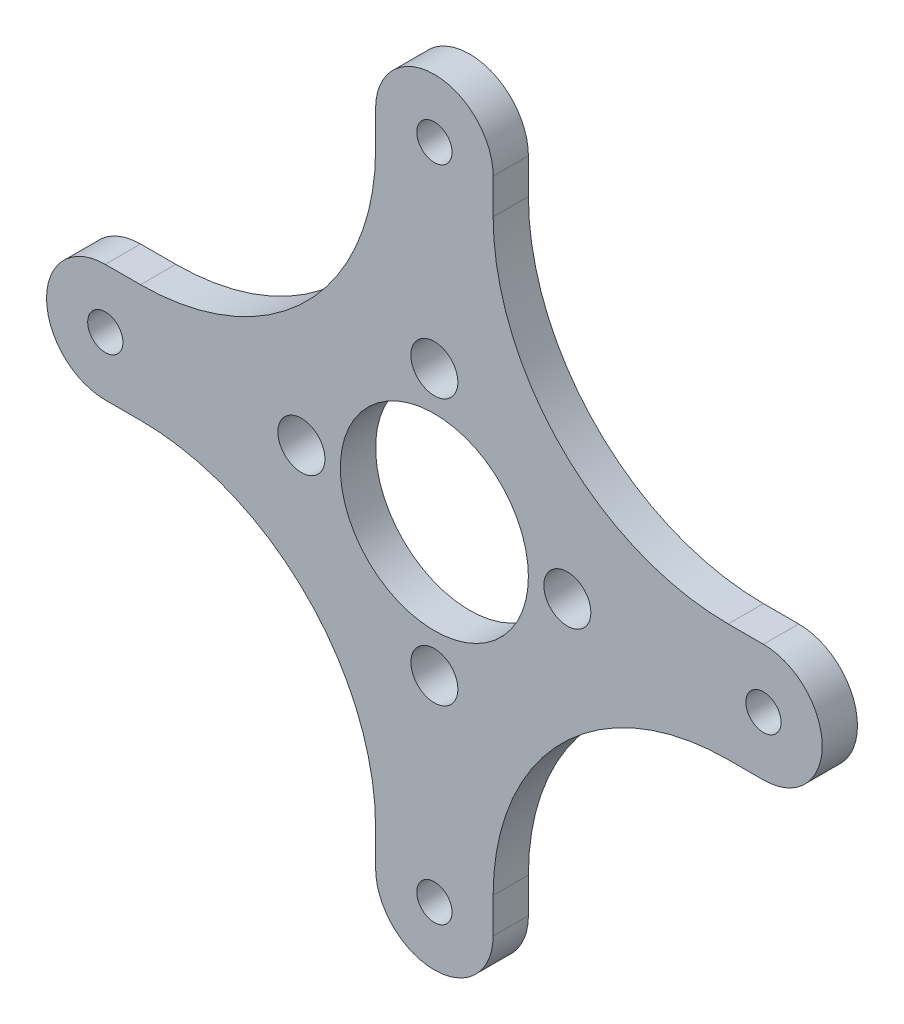
ISO-10303-21;
HEADER;
FILE_DESCRIPTION(('STEP AP214'),'2;1');
FILE_NAME('part.step','',(''),(''),'','','');
FILE_SCHEMA(('AUTOMOTIVE_DESIGN { 1 0 10303 214 1 1 1 1 }'));
ENDSEC;
DATA;
#1=APPLICATION_CONTEXT('core data for automotive mechanical design processes');
#2=APPLICATION_PROTOCOL_DEFINITION('international standard','automotive_design',2000,#1);
#3=PRODUCT_CONTEXT('',#1,'mechanical');
#4=PRODUCT('Part','Part','',(#3));
#5=PRODUCT_RELATED_PRODUCT_CATEGORY('part','',(#4));
#6=PRODUCT_DEFINITION_FORMATION('','',#4);
#7=PRODUCT_DEFINITION_CONTEXT('part definition',#1,'design');
#8=PRODUCT_DEFINITION('design','',#6,#7);
#9=PRODUCT_DEFINITION_SHAPE('','',#8);
#10=(LENGTH_UNIT() NAMED_UNIT(*) SI_UNIT(.MILLI.,.METRE.));
#11=(NAMED_UNIT(*) PLANE_ANGLE_UNIT() SI_UNIT($,.RADIAN.));
#12=(NAMED_UNIT(*) SI_UNIT($,.STERADIAN.) SOLID_ANGLE_UNIT());
#13=UNCERTAINTY_MEASURE_WITH_UNIT(LENGTH_MEASURE(1.E-05),#10,'distance_accuracy_value','');
#14=(GEOMETRIC_REPRESENTATION_CONTEXT(3) GLOBAL_UNCERTAINTY_ASSIGNED_CONTEXT((#13)) GLOBAL_UNIT_ASSIGNED_CONTEXT((#10,
#11,#12)) REPRESENTATION_CONTEXT('',''));
#15=CARTESIAN_POINT('',(0.,0.,0.));
#16=DIRECTION('',(0.,0.,1.));
#17=DIRECTION('',(1.,0.,0.));
#18=AXIS2_PLACEMENT_3D('',#15,#16,#17);
#19=CARTESIAN_POINT('',(0.,28.,3.));
#20=DIRECTION('',(0.,0.,1.));
#21=DIRECTION('',(1.,0.,0.));
#22=AXIS2_PLACEMENT_3D('',#19,#20,#21);
#23=PLANE('',#22);
#24=CARTESIAN_POINT('',(0.,11.3137084989848,3.));
#25=DIRECTION('',(0.,0.,1.));
#26=DIRECTION('',(1.,0.,0.));
#27=AXIS2_PLACEMENT_3D('',#24,#25,#26);
#28=CIRCLE('',#27,2.);
#29=CARTESIAN_POINT('',(2.,11.3137084989848,3.));
#30=VERTEX_POINT('',#29);
#31=EDGE_CURVE('E362',#30,#30,#28,.T.);
#32=ORIENTED_EDGE('',*,*,#31,.F.);
#33=EDGE_LOOP('',(#32));
#34=FACE_BOUND('',#33,.T.);
#35=CARTESIAN_POINT('',(0.,-11.3137084989848,3.));
#36=DIRECTION('',(0.,0.,1.));
#37=DIRECTION('',(1.,0.,0.));
#38=AXIS2_PLACEMENT_3D('',#35,#36,#37);
#39=CIRCLE('',#38,2.);
#40=CARTESIAN_POINT('',(2.,-11.3137084989848,3.));
#41=VERTEX_POINT('',#40);
#42=EDGE_CURVE('E374',#41,#41,#39,.T.);
#43=ORIENTED_EDGE('',*,*,#42,.F.);
#44=EDGE_LOOP('',(#43));
#45=FACE_BOUND('',#44,.T.);
#46=CARTESIAN_POINT('',(-28.,0.,3.));
#47=DIRECTION('',(0.,0.,1.));
#48=DIRECTION('',(1.,0.,0.));
#49=AXIS2_PLACEMENT_3D('',#46,#47,#48);
#50=CIRCLE('',#49,1.5);
#51=CARTESIAN_POINT('',(-26.5,0.,3.));
#52=VERTEX_POINT('',#51);
#53=EDGE_CURVE('E386',#52,#52,#50,.T.);
#54=ORIENTED_EDGE('',*,*,#53,.F.);
#55=EDGE_LOOP('',(#54));
#56=FACE_BOUND('',#55,.T.);
#57=CARTESIAN_POINT('',(28.,0.,3.));
#58=DIRECTION('',(0.,0.,1.));
#59=DIRECTION('',(1.,0.,0.));
#60=AXIS2_PLACEMENT_3D('',#57,#58,#59);
#61=CIRCLE('',#60,1.5);
#62=CARTESIAN_POINT('',(29.5,0.,3.));
#63=VERTEX_POINT('',#62);
#64=EDGE_CURVE('E398',#63,#63,#61,.T.);
#65=ORIENTED_EDGE('',*,*,#64,.F.);
#66=EDGE_LOOP('',(#65));
#67=FACE_BOUND('',#66,.T.);
#68=CARTESIAN_POINT('',(0.,28.,3.));
#69=DIRECTION('',(0.,0.,1.));
#70=DIRECTION('',(1.,0.,0.));
#71=AXIS2_PLACEMENT_3D('',#68,#69,#70);
#72=CIRCLE('',#71,5.);
#73=CARTESIAN_POINT('',(5.,28.,3.));
#74=VERTEX_POINT('',#73);
#75=CARTESIAN_POINT('',(-5.,28.,3.));
#76=VERTEX_POINT('',#75);
#77=EDGE_CURVE('E208',#74,#76,#72,.T.);
#78=ORIENTED_EDGE('',*,*,#77,.T.);
#79=DIRECTION('',(0.,-1.,0.));
#80=VECTOR('',#79,1.);
#81=CARTESIAN_POINT('',(-5.,28.,3.));
#82=LINE('',#81,#80);
#83=CARTESIAN_POINT('',(-5.00000000000008,25.0000000000004,3.));
#84=VERTEX_POINT('',#83);
#85=EDGE_CURVE('E116',#76,#84,#82,.T.);
#86=ORIENTED_EDGE('',*,*,#85,.T.);
#87=CARTESIAN_POINT('',(-25.0000000000001,25.0000000000003,3.));
#88=DIRECTION('',(0.,0.,-1.));
#89=DIRECTION('',(-1.,0.,0.));
#90=AXIS2_PLACEMENT_3D('',#87,#88,#89);
#91=CIRCLE('',#90,20.);
#92=CARTESIAN_POINT('',(-25.0000000000004,5.00000000000034,3.));
#93=VERTEX_POINT('',#92);
#94=EDGE_CURVE('E247',#84,#93,#91,.T.);
#95=ORIENTED_EDGE('',*,*,#94,.T.);
#96=DIRECTION('',(-1.,-2.16840434497114E-13,0.));
#97=VECTOR('',#96,1.);
#98=CARTESIAN_POINT('',(-28.0000000000002,4.99999999999969,3.));
#99=LINE('',#98,#97);
#100=CARTESIAN_POINT('',(-28.0000000000002,4.99999999999969,3.));
#101=VERTEX_POINT('',#100);
#102=EDGE_CURVE('E266',#93,#101,#99,.T.);
#103=ORIENTED_EDGE('',*,*,#102,.T.);
#104=CARTESIAN_POINT('',(-28.0000000000002,-3.10005425523019E-13,3.));
#105=DIRECTION('',(0.,0.,1.));
#106=DIRECTION('',(1.,0.,0.));
#107=AXIS2_PLACEMENT_3D('',#104,#105,#106);
#108=CIRCLE('',#107,5.);
#109=CARTESIAN_POINT('',(-28.0000000000002,-5.00000000000031,3.));
#110=VERTEX_POINT('',#109);
#111=EDGE_CURVE('E263',#101,#110,#108,.T.);
#112=ORIENTED_EDGE('',*,*,#111,.T.);
#113=DIRECTION('',(1.,0.,0.));
#114=VECTOR('',#113,1.);
#115=CARTESIAN_POINT('',(-28.0000000000002,-5.00000000000031,3.));
#116=LINE('',#115,#114);
#117=CARTESIAN_POINT('',(-24.9999999999991,-5.00000000000004,3.));
#118=VERTEX_POINT('',#117);
#119=EDGE_CURVE('E265',#110,#118,#116,.T.);
#120=ORIENTED_EDGE('',*,*,#119,.T.);
#121=CARTESIAN_POINT('',(-24.9999999999994,-25.,3.));
#122=DIRECTION('',(0.,0.,-1.));
#123=DIRECTION('',(1.,0.,0.));
#124=AXIS2_PLACEMENT_3D('',#121,#122,#123);
#125=CIRCLE('',#124,20.);
#126=CARTESIAN_POINT('',(-4.99999999999937,-25.,3.));
#127=VERTEX_POINT('',#126);
#128=EDGE_CURVE('E268',#118,#127,#125,.T.);
#129=ORIENTED_EDGE('',*,*,#128,.T.);
#130=DIRECTION('',(-1.76074432811614E-13,-1.,0.));
#131=VECTOR('',#130,1.);
#132=CARTESIAN_POINT('',(-4.9999999999999,-28.0000000000005,3.));
#133=LINE('',#132,#131);
#134=CARTESIAN_POINT('',(-4.9999999999999,-28.0000000000005,3.));
#135=VERTEX_POINT('',#134);
#136=EDGE_CURVE('E274',#127,#135,#133,.T.);
#137=ORIENTED_EDGE('',*,*,#136,.T.);
#138=CARTESIAN_POINT('',(1.00189062171885E-13,-28.0000000000005,3.));
#139=DIRECTION('',(0.,0.,1.));
#140=DIRECTION('',(1.,0.,0.));
#141=AXIS2_PLACEMENT_3D('',#138,#139,#140);
#142=CIRCLE('',#141,5.);
#143=CARTESIAN_POINT('',(5.0000000000001,-28.0000000000005,3.));
#144=VERTEX_POINT('',#143);
#145=EDGE_CURVE('E276',#135,#144,#142,.T.);
#146=ORIENTED_EDGE('',*,*,#145,.T.);
#147=DIRECTION('',(3.03287487716576E-13,1.,0.));
#148=VECTOR('',#147,1.);
#149=CARTESIAN_POINT('',(5.0000000000001,-28.0000000000005,3.));
#150=LINE('',#149,#148);
#151=CARTESIAN_POINT('',(5.00000000000111,-25.0000000000001,3.));
#152=VERTEX_POINT('',#151);
#153=EDGE_CURVE('E278',#144,#152,#150,.T.);
#154=ORIENTED_EDGE('',*,*,#153,.T.);
#155=CARTESIAN_POINT('',(25.000000000001,-25.,3.));
#156=DIRECTION('',(0.,0.,-1.));
#157=DIRECTION('',(1.,0.,0.));
#158=AXIS2_PLACEMENT_3D('',#155,#156,#157);
#159=CIRCLE('',#158,19.9999999999999);
#160=CARTESIAN_POINT('',(25.0000000000001,-5.00000000000021,3.));
#161=VERTEX_POINT('',#160);
#162=EDGE_CURVE('E280',#152,#161,#159,.T.);
#163=ORIENTED_EDGE('',*,*,#162,.T.);
#164=DIRECTION('',(1.,0.,0.));
#165=VECTOR('',#164,1.);
#166=CARTESIAN_POINT('',(28.0000000000003,-5.00000000000021,3.));
#167=LINE('',#166,#165);
#168=CARTESIAN_POINT('',(28.0000000000003,-5.00000000000021,3.));
#169=VERTEX_POINT('',#168);
#170=EDGE_CURVE('E282',#161,#169,#167,.T.);
#171=ORIENTED_EDGE('',*,*,#170,.T.);
#172=CARTESIAN_POINT('',(28.0000000000003,-2.10306222070793E-13,3.));
#173=DIRECTION('',(0.,0.,1.));
#174=DIRECTION('',(1.,0.,0.));
#175=AXIS2_PLACEMENT_3D('',#172,#173,#174);
#176=CIRCLE('',#175,5.);
#177=CARTESIAN_POINT('',(28.0000000000003,4.99999999999979,3.));
#178=VERTEX_POINT('',#177);
#179=EDGE_CURVE('E159',#169,#178,#176,.T.);
#180=ORIENTED_EDGE('',*,*,#179,.T.);
#181=DIRECTION('',(-1.,1.92554305833413E-13,0.));
#182=VECTOR('',#181,1.);
#183=CARTESIAN_POINT('',(28.0000000000003,4.99999999999979,3.));
#184=LINE('',#183,#182);
#185=CARTESIAN_POINT('',(25.0000000000001,5.00000000000037,3.));
#186=VERTEX_POINT('',#185);
#187=EDGE_CURVE('E153',#178,#186,#184,.T.);
#188=ORIENTED_EDGE('',*,*,#187,.T.);
#189=CARTESIAN_POINT('',(25.0000000000003,25.0000000000004,3.));
#190=DIRECTION('',(0.,0.,-1.));
#191=DIRECTION('',(-1.,0.,0.));
#192=AXIS2_PLACEMENT_3D('',#189,#190,#191);
#193=CIRCLE('',#192,20.);
#194=CARTESIAN_POINT('',(5.00000000000031,25.0000000000003,3.));
#195=VERTEX_POINT('',#194);
#196=EDGE_CURVE('E157',#186,#195,#193,.T.);
#197=ORIENTED_EDGE('',*,*,#196,.T.);
#198=DIRECTION('',(-1.00903082185995E-13,1.,0.));
#199=VECTOR('',#198,1.);
#200=CARTESIAN_POINT('',(5.,28.,3.));
#201=LINE('',#200,#199);
#202=EDGE_CURVE('E49',#195,#74,#201,.T.);
#203=ORIENTED_EDGE('',*,*,#202,.T.);
#204=EDGE_LOOP('',(#78,#86,#95,#103,#112,#120,#129,#137,#146,#154,#163,#171,#180,#188,#197,#203));
#205=FACE_BOUND('',#204,.T.);
#206=CARTESIAN_POINT('',(0.,28.,3.));
#207=DIRECTION('',(0.,0.,1.));
#208=DIRECTION('',(1.,0.,0.));
#209=AXIS2_PLACEMENT_3D('',#206,#207,#208);
#210=CIRCLE('',#209,1.5);
#211=CARTESIAN_POINT('',(1.5,28.,3.));
#212=VERTEX_POINT('',#211);
#213=EDGE_CURVE('E181',#212,#212,#210,.T.);
#214=ORIENTED_EDGE('',*,*,#213,.F.);
#215=EDGE_LOOP('',(#214));
#216=FACE_BOUND('',#215,.T.);
#217=CARTESIAN_POINT('',(0.,-28.,3.));
#218=DIRECTION('',(0.,0.,1.));
#219=DIRECTION('',(1.,0.,0.));
#220=AXIS2_PLACEMENT_3D('',#217,#218,#219);
#221=CIRCLE('',#220,1.5);
#222=CARTESIAN_POINT('',(1.5,-28.,3.));
#223=VERTEX_POINT('',#222);
#224=EDGE_CURVE('E392',#223,#223,#221,.T.);
#225=ORIENTED_EDGE('',*,*,#224,.F.);
#226=EDGE_LOOP('',(#225));
#227=FACE_BOUND('',#226,.T.);
#228=CARTESIAN_POINT('',(0.,0.,3.));
#229=DIRECTION('',(0.,0.,1.));
#230=DIRECTION('',(1.,0.,0.));
#231=AXIS2_PLACEMENT_3D('',#228,#229,#230);
#232=CIRCLE('',#231,8.);
#233=CARTESIAN_POINT('',(8.,0.,3.));
#234=VERTEX_POINT('',#233);
#235=EDGE_CURVE('E380',#234,#234,#232,.T.);
#236=ORIENTED_EDGE('',*,*,#235,.F.);
#237=EDGE_LOOP('',(#236));
#238=FACE_BOUND('',#237,.T.);
#239=CARTESIAN_POINT('',(-11.3137084989848,0.,3.));
#240=DIRECTION('',(0.,0.,1.));
#241=DIRECTION('',(1.,0.,0.));
#242=AXIS2_PLACEMENT_3D('',#239,#240,#241);
#243=CIRCLE('',#242,2.);
#244=CARTESIAN_POINT('',(-9.31370849898478,0.,3.));
#245=VERTEX_POINT('',#244);
#246=EDGE_CURVE('E368',#245,#245,#243,.T.);
#247=ORIENTED_EDGE('',*,*,#246,.F.);
#248=EDGE_LOOP('',(#247));
#249=FACE_BOUND('',#248,.T.);
#250=CARTESIAN_POINT('',(11.3137084989848,0.,3.));
#251=DIRECTION('',(0.,0.,1.));
#252=DIRECTION('',(1.,0.,0.));
#253=AXIS2_PLACEMENT_3D('',#250,#251,#252);
#254=CIRCLE('',#253,2.);
#255=CARTESIAN_POINT('',(13.3137084989848,0.,3.));
#256=VERTEX_POINT('',#255);
#257=EDGE_CURVE('E353',#256,#256,#254,.T.);
#258=ORIENTED_EDGE('',*,*,#257,.F.);
#259=EDGE_LOOP('',(#258));
#260=FACE_BOUND('',#259,.T.);
#261=ADVANCED_FACE('F32',(#34,#45,#56,#67,#205,#216,#227,#238,#249,#260),#23,.T.);
#262=CARTESIAN_POINT('',(0.,28.,0.));
#263=DIRECTION('',(0.,0.,1.));
#264=DIRECTION('',(1.,0.,0.));
#265=AXIS2_PLACEMENT_3D('',#262,#263,#264);
#266=PLANE('',#265);
#267=CARTESIAN_POINT('',(0.,28.,0.));
#268=DIRECTION('',(0.,0.,1.));
#269=DIRECTION('',(1.,0.,0.));
#270=AXIS2_PLACEMENT_3D('',#267,#268,#269);
#271=CIRCLE('',#270,5.);
#272=CARTESIAN_POINT('',(5.,28.,0.));
#273=VERTEX_POINT('',#272);
#274=CARTESIAN_POINT('',(-5.,28.,0.));
#275=VERTEX_POINT('',#274);
#276=EDGE_CURVE('E177',#273,#275,#271,.T.);
#277=ORIENTED_EDGE('',*,*,#276,.F.);
#278=DIRECTION('',(-1.00903082185995E-13,1.,0.));
#279=VECTOR('',#278,1.);
#280=CARTESIAN_POINT('',(5.,28.,0.));
#281=LINE('',#280,#279);
#282=CARTESIAN_POINT('',(5.00000000000031,25.0000000000003,0.));
#283=VERTEX_POINT('',#282);
#284=EDGE_CURVE('E108',#283,#273,#281,.T.);
#285=ORIENTED_EDGE('',*,*,#284,.F.);
#286=CARTESIAN_POINT('',(25.0000000000003,25.0000000000004,0.));
#287=DIRECTION('',(0.,0.,-1.));
#288=DIRECTION('',(-1.,0.,0.));
#289=AXIS2_PLACEMENT_3D('',#286,#287,#288);
#290=CIRCLE('',#289,20.);
#291=CARTESIAN_POINT('',(25.0000000000001,5.00000000000037,0.));
#292=VERTEX_POINT('',#291);
#293=EDGE_CURVE('E102',#292,#283,#290,.T.);
#294=ORIENTED_EDGE('',*,*,#293,.F.);
#295=DIRECTION('',(-1.,1.92554305833413E-13,0.));
#296=VECTOR('',#295,1.);
#297=CARTESIAN_POINT('',(28.0000000000003,4.99999999999979,0.));
#298=LINE('',#297,#296);
#299=CARTESIAN_POINT('',(28.0000000000003,4.99999999999979,0.));
#300=VERTEX_POINT('',#299);
#301=EDGE_CURVE('E167',#300,#292,#298,.T.);
#302=ORIENTED_EDGE('',*,*,#301,.F.);
#303=CARTESIAN_POINT('',(28.0000000000003,-2.10306222070793E-13,0.));
#304=DIRECTION('',(0.,0.,1.));
#305=DIRECTION('',(1.,0.,0.));
#306=AXIS2_PLACEMENT_3D('',#303,#304,#305);
#307=CIRCLE('',#306,5.);
#308=CARTESIAN_POINT('',(28.0000000000003,-5.00000000000021,0.));
#309=VERTEX_POINT('',#308);
#310=EDGE_CURVE('E203',#309,#300,#307,.T.);
#311=ORIENTED_EDGE('',*,*,#310,.F.);
#312=DIRECTION('',(1.,0.,0.));
#313=VECTOR('',#312,1.);
#314=CARTESIAN_POINT('',(28.0000000000003,-5.00000000000021,0.));
#315=LINE('',#314,#313);
#316=CARTESIAN_POINT('',(25.0000000000001,-5.00000000000021,0.));
#317=VERTEX_POINT('',#316);
#318=EDGE_CURVE('E201',#317,#309,#315,.T.);
#319=ORIENTED_EDGE('',*,*,#318,.F.);
#320=CARTESIAN_POINT('',(25.000000000001,-25.,0.));
#321=DIRECTION('',(0.,0.,-1.));
#322=DIRECTION('',(1.,0.,0.));
#323=AXIS2_PLACEMENT_3D('',#320,#321,#322);
#324=CIRCLE('',#323,19.9999999999999);
#325=CARTESIAN_POINT('',(5.00000000000111,-25.0000000000001,0.));
#326=VERTEX_POINT('',#325);
#327=EDGE_CURVE('E199',#326,#317,#324,.T.);
#328=ORIENTED_EDGE('',*,*,#327,.F.);
#329=DIRECTION('',(3.03287487716576E-13,1.,0.));
#330=VECTOR('',#329,1.);
#331=CARTESIAN_POINT('',(5.0000000000001,-28.0000000000005,0.));
#332=LINE('',#331,#330);
#333=CARTESIAN_POINT('',(5.0000000000001,-28.0000000000005,0.));
#334=VERTEX_POINT('',#333);
#335=EDGE_CURVE('E197',#334,#326,#332,.T.);
#336=ORIENTED_EDGE('',*,*,#335,.F.);
#337=CARTESIAN_POINT('',(1.00189062171885E-13,-28.0000000000005,0.));
#338=DIRECTION('',(0.,0.,1.));
#339=DIRECTION('',(1.,0.,0.));
#340=AXIS2_PLACEMENT_3D('',#337,#338,#339);
#341=CIRCLE('',#340,5.);
#342=CARTESIAN_POINT('',(-4.9999999999999,-28.0000000000005,0.));
#343=VERTEX_POINT('',#342);
#344=EDGE_CURVE('E195',#343,#334,#341,.T.);
#345=ORIENTED_EDGE('',*,*,#344,.F.);
#346=DIRECTION('',(-1.76074432811614E-13,-1.,0.));
#347=VECTOR('',#346,1.);
#348=CARTESIAN_POINT('',(-4.9999999999999,-28.0000000000005,0.));
#349=LINE('',#348,#347);
#350=CARTESIAN_POINT('',(-4.99999999999937,-25.,0.));
#351=VERTEX_POINT('',#350);
#352=EDGE_CURVE('E193',#351,#343,#349,.T.);
#353=ORIENTED_EDGE('',*,*,#352,.F.);
#354=CARTESIAN_POINT('',(-24.9999999999994,-25.,0.));
#355=DIRECTION('',(0.,0.,-1.));
#356=DIRECTION('',(1.,0.,0.));
#357=AXIS2_PLACEMENT_3D('',#354,#355,#356);
#358=CIRCLE('',#357,20.);
#359=CARTESIAN_POINT('',(-24.9999999999991,-5.00000000000004,0.));
#360=VERTEX_POINT('',#359);
#361=EDGE_CURVE('E191',#360,#351,#358,.T.);
#362=ORIENTED_EDGE('',*,*,#361,.F.);
#363=DIRECTION('',(1.,0.,0.));
#364=VECTOR('',#363,1.);
#365=CARTESIAN_POINT('',(-28.0000000000002,-5.00000000000031,0.));
#366=LINE('',#365,#364);
#367=CARTESIAN_POINT('',(-28.0000000000002,-5.00000000000031,0.));
#368=VERTEX_POINT('',#367);
#369=EDGE_CURVE('E189',#368,#360,#366,.T.);
#370=ORIENTED_EDGE('',*,*,#369,.F.);
#371=CARTESIAN_POINT('',(-28.0000000000002,-3.10005425523019E-13,0.));
#372=DIRECTION('',(0.,0.,1.));
#373=DIRECTION('',(1.,0.,0.));
#374=AXIS2_PLACEMENT_3D('',#371,#372,#373);
#375=CIRCLE('',#374,5.);
#376=CARTESIAN_POINT('',(-28.0000000000002,4.99999999999969,0.));
#377=VERTEX_POINT('',#376);
#378=EDGE_CURVE('E187',#377,#368,#375,.T.);
#379=ORIENTED_EDGE('',*,*,#378,.F.);
#380=DIRECTION('',(-1.,-2.16840434497114E-13,0.));
#381=VECTOR('',#380,1.);
#382=CARTESIAN_POINT('',(-28.0000000000002,4.99999999999969,0.));
#383=LINE('',#382,#381);
#384=CARTESIAN_POINT('',(-25.0000000000004,5.00000000000034,0.));
#385=VERTEX_POINT('',#384);
#386=EDGE_CURVE('E185',#385,#377,#383,.T.);
#387=ORIENTED_EDGE('',*,*,#386,.F.);
#388=CARTESIAN_POINT('',(-25.0000000000001,25.0000000000003,0.));
#389=DIRECTION('',(0.,0.,-1.));
#390=DIRECTION('',(-1.,0.,0.));
#391=AXIS2_PLACEMENT_3D('',#388,#389,#390);
#392=CIRCLE('',#391,20.);
#393=CARTESIAN_POINT('',(-5.00000000000008,25.0000000000004,0.));
#394=VERTEX_POINT('',#393);
#395=EDGE_CURVE('E183',#394,#385,#392,.T.);
#396=ORIENTED_EDGE('',*,*,#395,.F.);
#397=DIRECTION('',(0.,-1.,0.));
#398=VECTOR('',#397,1.);
#399=CARTESIAN_POINT('',(-5.,28.,0.));
#400=LINE('',#399,#398);
#401=EDGE_CURVE('E180',#275,#394,#400,.T.);
#402=ORIENTED_EDGE('',*,*,#401,.F.);
#403=EDGE_LOOP('',(#277,#285,#294,#302,#311,#319,#328,#336,#345,#353,#362,#370,#379,#387,#396,#402));
#404=FACE_BOUND('',#403,.T.);
#405=CARTESIAN_POINT('',(0.,28.,0.));
#406=DIRECTION('',(0.,0.,1.));
#407=DIRECTION('',(1.,0.,0.));
#408=AXIS2_PLACEMENT_3D('',#405,#406,#407);
#409=CIRCLE('',#408,1.5);
#410=CARTESIAN_POINT('',(1.5,28.,0.));
#411=VERTEX_POINT('',#410);
#412=EDGE_CURVE('E401',#411,#411,#409,.T.);
#413=ORIENTED_EDGE('',*,*,#412,.T.);
#414=EDGE_LOOP('',(#413));
#415=FACE_BOUND('',#414,.T.);
#416=CARTESIAN_POINT('',(28.,0.,0.));
#417=DIRECTION('',(0.,0.,1.));
#418=DIRECTION('',(1.,0.,0.));
#419=AXIS2_PLACEMENT_3D('',#416,#417,#418);
#420=CIRCLE('',#419,1.5);
#421=CARTESIAN_POINT('',(29.5,0.,0.));
#422=VERTEX_POINT('',#421);
#423=EDGE_CURVE('E395',#422,#422,#420,.T.);
#424=ORIENTED_EDGE('',*,*,#423,.T.);
#425=EDGE_LOOP('',(#424));
#426=FACE_BOUND('',#425,.T.);
#427=CARTESIAN_POINT('',(0.,-28.,0.));
#428=DIRECTION('',(0.,0.,1.));
#429=DIRECTION('',(1.,0.,0.));
#430=AXIS2_PLACEMENT_3D('',#427,#428,#429);
#431=CIRCLE('',#430,1.5);
#432=CARTESIAN_POINT('',(1.5,-28.,0.));
#433=VERTEX_POINT('',#432);
#434=EDGE_CURVE('E389',#433,#433,#431,.T.);
#435=ORIENTED_EDGE('',*,*,#434,.T.);
#436=EDGE_LOOP('',(#435));
#437=FACE_BOUND('',#436,.T.);
#438=CARTESIAN_POINT('',(-28.,0.,0.));
#439=DIRECTION('',(0.,0.,1.));
#440=DIRECTION('',(1.,0.,0.));
#441=AXIS2_PLACEMENT_3D('',#438,#439,#440);
#442=CIRCLE('',#441,1.5);
#443=CARTESIAN_POINT('',(-26.5,0.,0.));
#444=VERTEX_POINT('',#443);
#445=EDGE_CURVE('E383',#444,#444,#442,.T.);
#446=ORIENTED_EDGE('',*,*,#445,.T.);
#447=EDGE_LOOP('',(#446));
#448=FACE_BOUND('',#447,.T.);
#449=CARTESIAN_POINT('',(0.,0.,0.));
#450=DIRECTION('',(0.,0.,1.));
#451=DIRECTION('',(1.,0.,0.));
#452=AXIS2_PLACEMENT_3D('',#449,#450,#451);
#453=CIRCLE('',#452,8.);
#454=CARTESIAN_POINT('',(8.,0.,0.));
#455=VERTEX_POINT('',#454);
#456=EDGE_CURVE('E377',#455,#455,#453,.T.);
#457=ORIENTED_EDGE('',*,*,#456,.T.);
#458=EDGE_LOOP('',(#457));
#459=FACE_BOUND('',#458,.T.);
#460=CARTESIAN_POINT('',(0.,-11.3137084989848,0.));
#461=DIRECTION('',(0.,0.,1.));
#462=DIRECTION('',(1.,0.,0.));
#463=AXIS2_PLACEMENT_3D('',#460,#461,#462);
#464=CIRCLE('',#463,2.);
#465=CARTESIAN_POINT('',(2.,-11.3137084989848,0.));
#466=VERTEX_POINT('',#465);
#467=EDGE_CURVE('E371',#466,#466,#464,.T.);
#468=ORIENTED_EDGE('',*,*,#467,.T.);
#469=EDGE_LOOP('',(#468));
#470=FACE_BOUND('',#469,.T.);
#471=CARTESIAN_POINT('',(-11.3137084989848,0.,0.));
#472=DIRECTION('',(0.,0.,1.));
#473=DIRECTION('',(1.,0.,0.));
#474=AXIS2_PLACEMENT_3D('',#471,#472,#473);
#475=CIRCLE('',#474,2.);
#476=CARTESIAN_POINT('',(-9.31370849898478,0.,0.));
#477=VERTEX_POINT('',#476);
#478=EDGE_CURVE('E365',#477,#477,#475,.T.);
#479=ORIENTED_EDGE('',*,*,#478,.T.);
#480=EDGE_LOOP('',(#479));
#481=FACE_BOUND('',#480,.T.);
#482=CARTESIAN_POINT('',(0.,11.3137084989848,0.));
#483=DIRECTION('',(0.,0.,1.));
#484=DIRECTION('',(1.,0.,0.));
#485=AXIS2_PLACEMENT_3D('',#482,#483,#484);
#486=CIRCLE('',#485,2.);
#487=CARTESIAN_POINT('',(2.,11.3137084989848,0.));
#488=VERTEX_POINT('',#487);
#489=EDGE_CURVE('E359',#488,#488,#486,.T.);
#490=ORIENTED_EDGE('',*,*,#489,.T.);
#491=EDGE_LOOP('',(#490));
#492=FACE_BOUND('',#491,.T.);
#493=CARTESIAN_POINT('',(11.3137084989848,0.,0.));
#494=DIRECTION('',(0.,0.,1.));
#495=DIRECTION('',(1.,0.,0.));
#496=AXIS2_PLACEMENT_3D('',#493,#494,#495);
#497=CIRCLE('',#496,2.);
#498=CARTESIAN_POINT('',(13.3137084989848,0.,0.));
#499=VERTEX_POINT('',#498);
#500=EDGE_CURVE('E356',#499,#499,#497,.T.);
#501=ORIENTED_EDGE('',*,*,#500,.T.);
#502=EDGE_LOOP('',(#501));
#503=FACE_BOUND('',#502,.T.);
#504=ADVANCED_FACE('F251',(#404,#415,#426,#437,#448,#459,#470,#481,#492,#503),#266,.F.);
#505=CARTESIAN_POINT('',(0.,28.,3.));
#506=DIRECTION('',(0.,0.,-1.));
#507=DIRECTION('',(-1.,0.,0.));
#508=AXIS2_PLACEMENT_3D('',#505,#506,#507);
#509=CYLINDRICAL_SURFACE('',#508,5.);
#510=ORIENTED_EDGE('',*,*,#276,.T.);
#511=DIRECTION('',(0.,0.,-1.));
#512=VECTOR('',#511,1.);
#513=CARTESIAN_POINT('',(-5.,28.,3.));
#514=LINE('',#513,#512);
#515=EDGE_CURVE('E11',#76,#275,#514,.T.);
#516=ORIENTED_EDGE('',*,*,#515,.F.);
#517=ORIENTED_EDGE('',*,*,#77,.F.);
#518=DIRECTION('',(0.,0.,-1.));
#519=VECTOR('',#518,1.);
#520=CARTESIAN_POINT('',(5.,28.,3.));
#521=LINE('',#520,#519);
#522=EDGE_CURVE('E173',#74,#273,#521,.T.);
#523=ORIENTED_EDGE('',*,*,#522,.T.);
#524=EDGE_LOOP('',(#510,#516,#517,#523));
#525=FACE_BOUND('',#524,.T.);
#526=ADVANCED_FACE('F34',(#525),#509,.T.);
#527=CARTESIAN_POINT('',(-5.,28.,3.));
#528=DIRECTION('',(1.,0.,0.));
#529=DIRECTION('',(0.,1.,0.));
#530=AXIS2_PLACEMENT_3D('',#527,#528,#529);
#531=PLANE('',#530);
#532=ORIENTED_EDGE('',*,*,#401,.T.);
#533=DIRECTION('',(0.,0.,-1.));
#534=VECTOR('',#533,1.);
#535=CARTESIAN_POINT('',(-5.00000000000008,25.0000000000004,3.));
#536=LINE('',#535,#534);
#537=EDGE_CURVE('E41',#84,#394,#536,.T.);
#538=ORIENTED_EDGE('',*,*,#537,.F.);
#539=ORIENTED_EDGE('',*,*,#85,.F.);
#540=ORIENTED_EDGE('',*,*,#515,.T.);
#541=EDGE_LOOP('',(#532,#538,#539,#540));
#542=FACE_BOUND('',#541,.T.);
#543=ADVANCED_FACE('F596',(#542),#531,.F.);
#544=CARTESIAN_POINT('',(-25.0000000000001,25.0000000000003,3.));
#545=DIRECTION('',(0.,0.,-1.));
#546=DIRECTION('',(-1.,0.,0.));
#547=AXIS2_PLACEMENT_3D('',#544,#545,#546);
#548=CYLINDRICAL_SURFACE('',#547,20.);
#549=ORIENTED_EDGE('',*,*,#395,.T.);
#550=DIRECTION('',(0.,0.,-1.));
#551=VECTOR('',#550,1.);
#552=CARTESIAN_POINT('',(-25.0000000000004,5.00000000000034,3.));
#553=LINE('',#552,#551);
#554=EDGE_CURVE('E239',#93,#385,#553,.T.);
#555=ORIENTED_EDGE('',*,*,#554,.F.);
#556=ORIENTED_EDGE('',*,*,#94,.F.);
#557=ORIENTED_EDGE('',*,*,#537,.T.);
#558=EDGE_LOOP('',(#549,#555,#556,#557));
#559=FACE_BOUND('',#558,.T.);
#560=ADVANCED_FACE('F245',(#559),#548,.F.);
#561=CARTESIAN_POINT('',(-28.0000000000002,4.99999999999969,3.));
#562=DIRECTION('',(2.16840434497114E-13,-1.,0.));
#563=DIRECTION('',(1.,2.16840434497114E-13,0.));
#564=AXIS2_PLACEMENT_3D('',#561,#562,#563);
#565=PLANE('',#564);
#566=ORIENTED_EDGE('',*,*,#386,.T.);
#567=DIRECTION('',(0.,0.,-1.));
#568=VECTOR('',#567,1.);
#569=CARTESIAN_POINT('',(-28.0000000000002,4.99999999999969,3.));
#570=LINE('',#569,#568);
#571=EDGE_CURVE('E236',#101,#377,#570,.T.);
#572=ORIENTED_EDGE('',*,*,#571,.F.);
#573=ORIENTED_EDGE('',*,*,#102,.F.);
#574=ORIENTED_EDGE('',*,*,#554,.T.);
#575=EDGE_LOOP('',(#566,#572,#573,#574));
#576=FACE_BOUND('',#575,.T.);
#577=ADVANCED_FACE('F257',(#576),#565,.F.);
#578=CARTESIAN_POINT('',(-28.0000000000002,-3.10005425523019E-13,3.));
#579=DIRECTION('',(0.,0.,-1.));
#580=DIRECTION('',(-1.,0.,0.));
#581=AXIS2_PLACEMENT_3D('',#578,#579,#580);
#582=CYLINDRICAL_SURFACE('',#581,5.);
#583=ORIENTED_EDGE('',*,*,#378,.T.);
#584=DIRECTION('',(0.,0.,-1.));
#585=VECTOR('',#584,1.);
#586=CARTESIAN_POINT('',(-28.0000000000002,-5.00000000000031,3.));
#587=LINE('',#586,#585);
#588=EDGE_CURVE('E233',#110,#368,#587,.T.);
#589=ORIENTED_EDGE('',*,*,#588,.F.);
#590=ORIENTED_EDGE('',*,*,#111,.F.);
#591=ORIENTED_EDGE('',*,*,#571,.T.);
#592=EDGE_LOOP('',(#583,#589,#590,#591));
#593=FACE_BOUND('',#592,.T.);
#594=ADVANCED_FACE('F261',(#593),#582,.T.);
#595=CARTESIAN_POINT('',(-28.0000000000002,-5.00000000000031,3.));
#596=DIRECTION('',(0.,1.,0.));
#597=DIRECTION('',(-1.,0.,0.));
#598=AXIS2_PLACEMENT_3D('',#595,#596,#597);
#599=PLANE('',#598);
#600=ORIENTED_EDGE('',*,*,#369,.T.);
#601=DIRECTION('',(0.,0.,-1.));
#602=VECTOR('',#601,1.);
#603=CARTESIAN_POINT('',(-24.9999999999991,-5.00000000000004,3.));
#604=LINE('',#603,#602);
#605=EDGE_CURVE('E230',#118,#360,#604,.T.);
#606=ORIENTED_EDGE('',*,*,#605,.F.);
#607=ORIENTED_EDGE('',*,*,#119,.F.);
#608=ORIENTED_EDGE('',*,*,#588,.T.);
#609=EDGE_LOOP('',(#600,#606,#607,#608));
#610=FACE_BOUND('',#609,.T.);
#611=ADVANCED_FACE('F561',(#610),#599,.F.);
#612=CARTESIAN_POINT('',(-24.9999999999994,-25.,3.));
#613=DIRECTION('',(0.,0.,-1.));
#614=DIRECTION('',(-1.,0.,0.));
#615=AXIS2_PLACEMENT_3D('',#612,#613,#614);
#616=CYLINDRICAL_SURFACE('',#615,20.);
#617=ORIENTED_EDGE('',*,*,#361,.T.);
#618=DIRECTION('',(0.,0.,-1.));
#619=VECTOR('',#618,1.);
#620=CARTESIAN_POINT('',(-4.99999999999937,-25.,3.));
#621=LINE('',#620,#619);
#622=EDGE_CURVE('E227',#127,#351,#621,.T.);
#623=ORIENTED_EDGE('',*,*,#622,.F.);
#624=ORIENTED_EDGE('',*,*,#128,.F.);
#625=ORIENTED_EDGE('',*,*,#605,.T.);
#626=EDGE_LOOP('',(#617,#623,#624,#625));
#627=FACE_BOUND('',#626,.T.);
#628=ADVANCED_FACE('F551',(#627),#616,.F.);
#629=CARTESIAN_POINT('',(-4.9999999999999,-28.0000000000005,3.));
#630=DIRECTION('',(1.,-1.76074432811614E-13,0.));
#631=DIRECTION('',(1.76074432811614E-13,1.,0.));
#632=AXIS2_PLACEMENT_3D('',#629,#630,#631);
#633=PLANE('',#632);
#634=ORIENTED_EDGE('',*,*,#352,.T.);
#635=DIRECTION('',(0.,0.,-1.));
#636=VECTOR('',#635,1.);
#637=CARTESIAN_POINT('',(-4.9999999999999,-28.0000000000005,3.));
#638=LINE('',#637,#636);
#639=EDGE_CURVE('E224',#135,#343,#638,.T.);
#640=ORIENTED_EDGE('',*,*,#639,.F.);
#641=ORIENTED_EDGE('',*,*,#136,.F.);
#642=ORIENTED_EDGE('',*,*,#622,.T.);
#643=EDGE_LOOP('',(#634,#640,#641,#642));
#644=FACE_BOUND('',#643,.T.);
#645=ADVANCED_FACE('F541',(#644),#633,.F.);
#646=CARTESIAN_POINT('',(1.00189062171885E-13,-28.0000000000005,3.));
#647=DIRECTION('',(0.,0.,-1.));
#648=DIRECTION('',(-1.,0.,0.));
#649=AXIS2_PLACEMENT_3D('',#646,#647,#648);
#650=CYLINDRICAL_SURFACE('',#649,5.);
#651=ORIENTED_EDGE('',*,*,#344,.T.);
#652=DIRECTION('',(0.,0.,-1.));
#653=VECTOR('',#652,1.);
#654=CARTESIAN_POINT('',(5.0000000000001,-28.0000000000005,3.));
#655=LINE('',#654,#653);
#656=EDGE_CURVE('E221',#144,#334,#655,.T.);
#657=ORIENTED_EDGE('',*,*,#656,.F.);
#658=ORIENTED_EDGE('',*,*,#145,.F.);
#659=ORIENTED_EDGE('',*,*,#639,.T.);
#660=EDGE_LOOP('',(#651,#657,#658,#659));
#661=FACE_BOUND('',#660,.T.);
#662=ADVANCED_FACE('F531',(#661),#650,.T.);
#663=CARTESIAN_POINT('',(5.0000000000001,-28.0000000000005,3.));
#664=DIRECTION('',(-1.,3.03287487716576E-13,0.));
#665=DIRECTION('',(-3.03287487716576E-13,-1.,0.));
#666=AXIS2_PLACEMENT_3D('',#663,#664,#665);
#667=PLANE('',#666);
#668=ORIENTED_EDGE('',*,*,#335,.T.);
#669=DIRECTION('',(0.,0.,-1.));
#670=VECTOR('',#669,1.);
#671=CARTESIAN_POINT('',(5.00000000000111,-25.0000000000001,3.));
#672=LINE('',#671,#670);
#673=EDGE_CURVE('E218',#152,#326,#672,.T.);
#674=ORIENTED_EDGE('',*,*,#673,.F.);
#675=ORIENTED_EDGE('',*,*,#153,.F.);
#676=ORIENTED_EDGE('',*,*,#656,.T.);
#677=EDGE_LOOP('',(#668,#674,#675,#676));
#678=FACE_BOUND('',#677,.T.);
#679=ADVANCED_FACE('F521',(#678),#667,.F.);
#680=CARTESIAN_POINT('',(25.000000000001,-25.,3.));
#681=DIRECTION('',(0.,0.,-1.));
#682=DIRECTION('',(-1.,0.,0.));
#683=AXIS2_PLACEMENT_3D('',#680,#681,#682);
#684=CYLINDRICAL_SURFACE('',#683,19.9999999999999);
#685=ORIENTED_EDGE('',*,*,#327,.T.);
#686=DIRECTION('',(0.,0.,-1.));
#687=VECTOR('',#686,1.);
#688=CARTESIAN_POINT('',(25.0000000000001,-5.00000000000021,3.));
#689=LINE('',#688,#687);
#690=EDGE_CURVE('E215',#161,#317,#689,.T.);
#691=ORIENTED_EDGE('',*,*,#690,.F.);
#692=ORIENTED_EDGE('',*,*,#162,.F.);
#693=ORIENTED_EDGE('',*,*,#673,.T.);
#694=EDGE_LOOP('',(#685,#691,#692,#693));
#695=FACE_BOUND('',#694,.T.);
#696=ADVANCED_FACE('F512',(#695),#684,.F.);
#697=CARTESIAN_POINT('',(28.0000000000003,-5.00000000000021,3.));
#698=DIRECTION('',(0.,1.,0.));
#699=DIRECTION('',(-1.,0.,0.));
#700=AXIS2_PLACEMENT_3D('',#697,#698,#699);
#701=PLANE('',#700);
#702=ORIENTED_EDGE('',*,*,#318,.T.);
#703=DIRECTION('',(0.,0.,-1.));
#704=VECTOR('',#703,1.);
#705=CARTESIAN_POINT('',(28.0000000000003,-5.00000000000021,3.));
#706=LINE('',#705,#704);
#707=EDGE_CURVE('E212',#169,#309,#706,.T.);
#708=ORIENTED_EDGE('',*,*,#707,.F.);
#709=ORIENTED_EDGE('',*,*,#170,.F.);
#710=ORIENTED_EDGE('',*,*,#690,.T.);
#711=EDGE_LOOP('',(#702,#708,#709,#710));
#712=FACE_BOUND('',#711,.T.);
#713=ADVANCED_FACE('F288',(#712),#701,.F.);
#714=CARTESIAN_POINT('',(28.0000000000003,-2.10306222070793E-13,3.));
#715=DIRECTION('',(0.,0.,-1.));
#716=DIRECTION('',(-1.,0.,0.));
#717=AXIS2_PLACEMENT_3D('',#714,#715,#716);
#718=CYLINDRICAL_SURFACE('',#717,5.);
#719=ORIENTED_EDGE('',*,*,#310,.T.);
#720=DIRECTION('',(0.,0.,-1.));
#721=VECTOR('',#720,1.);
#722=CARTESIAN_POINT('',(28.0000000000003,4.99999999999979,3.));
#723=LINE('',#722,#721);
#724=EDGE_CURVE('E168',#178,#300,#723,.T.);
#725=ORIENTED_EDGE('',*,*,#724,.F.);
#726=ORIENTED_EDGE('',*,*,#179,.F.);
#727=ORIENTED_EDGE('',*,*,#707,.T.);
#728=EDGE_LOOP('',(#719,#725,#726,#727));
#729=FACE_BOUND('',#728,.T.);
#730=ADVANCED_FACE('F292',(#729),#718,.T.);
#731=CARTESIAN_POINT('',(28.0000000000003,4.99999999999979,3.));
#732=DIRECTION('',(-1.92554305833413E-13,-1.,0.));
#733=DIRECTION('',(1.,-1.92554305833413E-13,0.));
#734=AXIS2_PLACEMENT_3D('',#731,#732,#733);
#735=PLANE('',#734);
#736=ORIENTED_EDGE('',*,*,#301,.T.);
#737=DIRECTION('',(0.,0.,-1.));
#738=VECTOR('',#737,1.);
#739=CARTESIAN_POINT('',(25.0000000000001,5.00000000000037,3.));
#740=LINE('',#739,#738);
#741=EDGE_CURVE('E164',#186,#292,#740,.T.);
#742=ORIENTED_EDGE('',*,*,#741,.F.);
#743=ORIENTED_EDGE('',*,*,#187,.F.);
#744=ORIENTED_EDGE('',*,*,#724,.T.);
#745=EDGE_LOOP('',(#736,#742,#743,#744));
#746=FACE_BOUND('',#745,.T.);
#747=ADVANCED_FACE('F165',(#746),#735,.F.);
#748=CARTESIAN_POINT('',(25.0000000000003,25.0000000000004,3.));
#749=DIRECTION('',(0.,0.,-1.));
#750=DIRECTION('',(-1.,0.,0.));
#751=AXIS2_PLACEMENT_3D('',#748,#749,#750);
#752=CYLINDRICAL_SURFACE('',#751,20.);
#753=ORIENTED_EDGE('',*,*,#293,.T.);
#754=DIRECTION('',(0.,0.,-1.));
#755=VECTOR('',#754,1.);
#756=CARTESIAN_POINT('',(5.00000000000031,25.0000000000003,3.));
#757=LINE('',#756,#755);
#758=EDGE_CURVE('E169',#195,#283,#757,.T.);
#759=ORIENTED_EDGE('',*,*,#758,.F.);
#760=ORIENTED_EDGE('',*,*,#196,.F.);
#761=ORIENTED_EDGE('',*,*,#741,.T.);
#762=EDGE_LOOP('',(#753,#759,#760,#761));
#763=FACE_BOUND('',#762,.T.);
#764=ADVANCED_FACE('F171',(#763),#752,.F.);
#765=CARTESIAN_POINT('',(5.,28.,3.));
#766=DIRECTION('',(-1.,-1.00903082185995E-13,0.));
#767=DIRECTION('',(1.00903082185995E-13,-1.,0.));
#768=AXIS2_PLACEMENT_3D('',#765,#766,#767);
#769=PLANE('',#768);
#770=ORIENTED_EDGE('',*,*,#284,.T.);
#771=ORIENTED_EDGE('',*,*,#522,.F.);
#772=ORIENTED_EDGE('',*,*,#202,.F.);
#773=ORIENTED_EDGE('',*,*,#758,.T.);
#774=EDGE_LOOP('',(#770,#771,#772,#773));
#775=FACE_BOUND('',#774,.T.);
#776=ADVANCED_FACE('F296',(#775),#769,.F.);
#777=CARTESIAN_POINT('',(0.,28.,3.));
#778=DIRECTION('',(0.,0.,-1.));
#779=DIRECTION('',(-1.,0.,0.));
#780=AXIS2_PLACEMENT_3D('',#777,#778,#779);
#781=CYLINDRICAL_SURFACE('',#780,1.5);
#782=ORIENTED_EDGE('',*,*,#213,.T.);
#783=EDGE_LOOP('',(#782));
#784=FACE_BOUND('',#783,.T.);
#785=ORIENTED_EDGE('',*,*,#412,.F.);
#786=EDGE_LOOP('',(#785));
#787=FACE_BOUND('',#786,.T.);
#788=ADVANCED_FACE('F298',(#784,#787),#781,.F.);
#789=CARTESIAN_POINT('',(28.,0.,3.));
#790=DIRECTION('',(0.,0.,-1.));
#791=DIRECTION('',(-1.,0.,0.));
#792=AXIS2_PLACEMENT_3D('',#789,#790,#791);
#793=CYLINDRICAL_SURFACE('',#792,1.5);
#794=ORIENTED_EDGE('',*,*,#64,.T.);
#795=EDGE_LOOP('',(#794));
#796=FACE_BOUND('',#795,.T.);
#797=ORIENTED_EDGE('',*,*,#423,.F.);
#798=EDGE_LOOP('',(#797));
#799=FACE_BOUND('',#798,.T.);
#800=ADVANCED_FACE('F304',(#796,#799),#793,.F.);
#801=CARTESIAN_POINT('',(0.,-28.,3.));
#802=DIRECTION('',(0.,0.,-1.));
#803=DIRECTION('',(-1.,0.,0.));
#804=AXIS2_PLACEMENT_3D('',#801,#802,#803);
#805=CYLINDRICAL_SURFACE('',#804,1.5);
#806=ORIENTED_EDGE('',*,*,#224,.T.);
#807=EDGE_LOOP('',(#806));
#808=FACE_BOUND('',#807,.T.);
#809=ORIENTED_EDGE('',*,*,#434,.F.);
#810=EDGE_LOOP('',(#809));
#811=FACE_BOUND('',#810,.T.);
#812=ADVANCED_FACE('F320',(#808,#811),#805,.F.);
#813=CARTESIAN_POINT('',(-28.,0.,3.));
#814=DIRECTION('',(0.,0.,-1.));
#815=DIRECTION('',(-1.,0.,0.));
#816=AXIS2_PLACEMENT_3D('',#813,#814,#815);
#817=CYLINDRICAL_SURFACE('',#816,1.5);
#818=ORIENTED_EDGE('',*,*,#53,.T.);
#819=EDGE_LOOP('',(#818));
#820=FACE_BOUND('',#819,.T.);
#821=ORIENTED_EDGE('',*,*,#445,.F.);
#822=EDGE_LOOP('',(#821));
#823=FACE_BOUND('',#822,.T.);
#824=ADVANCED_FACE('F324',(#820,#823),#817,.F.);
#825=CARTESIAN_POINT('',(0.,0.,3.));
#826=DIRECTION('',(0.,0.,-1.));
#827=DIRECTION('',(-1.,0.,0.));
#828=AXIS2_PLACEMENT_3D('',#825,#826,#827);
#829=CYLINDRICAL_SURFACE('',#828,8.);
#830=ORIENTED_EDGE('',*,*,#235,.T.);
#831=EDGE_LOOP('',(#830));
#832=FACE_BOUND('',#831,.T.);
#833=ORIENTED_EDGE('',*,*,#456,.F.);
#834=EDGE_LOOP('',(#833));
#835=FACE_BOUND('',#834,.T.);
#836=ADVANCED_FACE('F328',(#832,#835),#829,.F.);
#837=CARTESIAN_POINT('',(0.,-11.3137084989848,3.));
#838=DIRECTION('',(0.,0.,-1.));
#839=DIRECTION('',(-1.,0.,0.));
#840=AXIS2_PLACEMENT_3D('',#837,#838,#839);
#841=CYLINDRICAL_SURFACE('',#840,2.);
#842=ORIENTED_EDGE('',*,*,#42,.T.);
#843=EDGE_LOOP('',(#842));
#844=FACE_BOUND('',#843,.T.);
#845=ORIENTED_EDGE('',*,*,#467,.F.);
#846=EDGE_LOOP('',(#845));
#847=FACE_BOUND('',#846,.T.);
#848=ADVANCED_FACE('F332',(#844,#847),#841,.F.);
#849=CARTESIAN_POINT('',(-11.3137084989848,0.,3.));
#850=DIRECTION('',(0.,0.,-1.));
#851=DIRECTION('',(-1.,0.,0.));
#852=AXIS2_PLACEMENT_3D('',#849,#850,#851);
#853=CYLINDRICAL_SURFACE('',#852,2.);
#854=ORIENTED_EDGE('',*,*,#246,.T.);
#855=EDGE_LOOP('',(#854));
#856=FACE_BOUND('',#855,.T.);
#857=ORIENTED_EDGE('',*,*,#478,.F.);
#858=EDGE_LOOP('',(#857));
#859=FACE_BOUND('',#858,.T.);
#860=ADVANCED_FACE('F336',(#856,#859),#853,.F.);
#861=CARTESIAN_POINT('',(0.,11.3137084989848,3.));
#862=DIRECTION('',(0.,0.,-1.));
#863=DIRECTION('',(-1.,0.,0.));
#864=AXIS2_PLACEMENT_3D('',#861,#862,#863);
#865=CYLINDRICAL_SURFACE('',#864,2.);
#866=ORIENTED_EDGE('',*,*,#31,.T.);
#867=EDGE_LOOP('',(#866));
#868=FACE_BOUND('',#867,.T.);
#869=ORIENTED_EDGE('',*,*,#489,.F.);
#870=EDGE_LOOP('',(#869));
#871=FACE_BOUND('',#870,.T.);
#872=ADVANCED_FACE('F340',(#868,#871),#865,.F.);
#873=CARTESIAN_POINT('',(11.3137084989848,0.,3.));
#874=DIRECTION('',(0.,0.,-1.));
#875=DIRECTION('',(-1.,0.,0.));
#876=AXIS2_PLACEMENT_3D('',#873,#874,#875);
#877=CYLINDRICAL_SURFACE('',#876,2.);
#878=ORIENTED_EDGE('',*,*,#257,.T.);
#879=EDGE_LOOP('',(#878));
#880=FACE_BOUND('',#879,.T.);
#881=ORIENTED_EDGE('',*,*,#500,.F.);
#882=EDGE_LOOP('',(#881));
#883=FACE_BOUND('',#882,.T.);
#884=ADVANCED_FACE('F344',(#880,#883),#877,.F.);
#885=CLOSED_SHELL('',(#261,#504,#526,#543,#560,#577,#594,#611,#628,#645,#662,#679,#696,#713,
#730,#747,#764,#776,#788,#800,#812,#824,#836,#848,#860,#872,#884));
#886=MANIFOLD_SOLID_BREP('B2',#885);
#887=ADVANCED_BREP_SHAPE_REPRESENTATION('',(#18,#886),#14);
#888=SHAPE_DEFINITION_REPRESENTATION(#9,#887);
ENDSEC;
END-ISO-10303-21;
